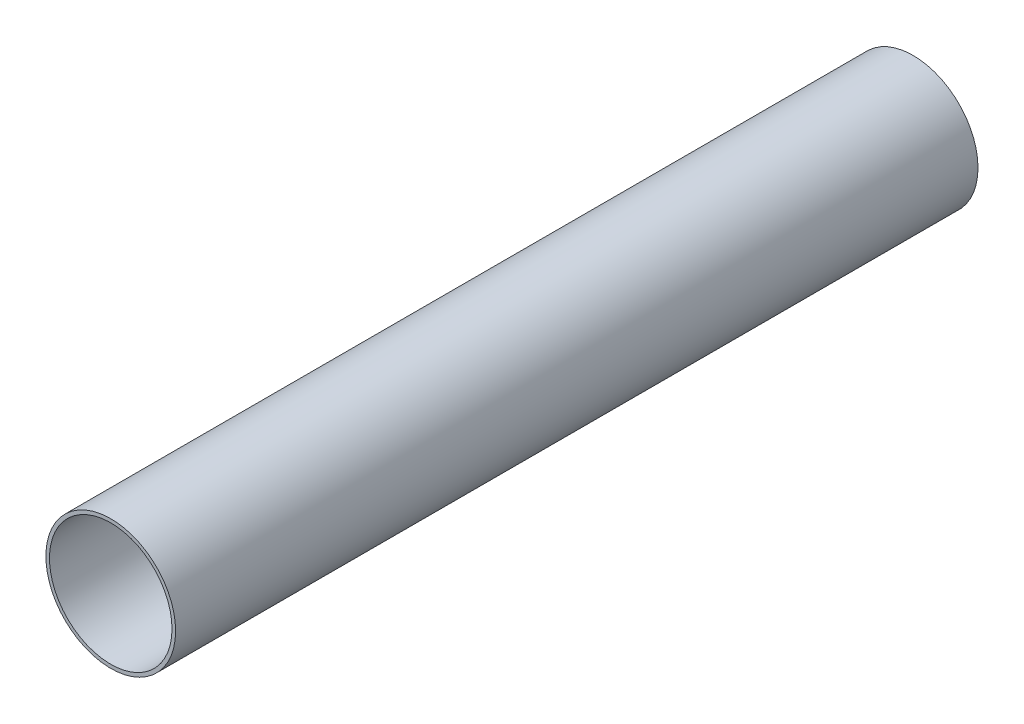
ISO-10303-21;
HEADER;
FILE_DESCRIPTION(('STEP AP214'),'2;1');
FILE_NAME('part.step','',(''),(''),'','','');
FILE_SCHEMA(('AUTOMOTIVE_DESIGN { 1 0 10303 214 1 1 1 1 }'));
ENDSEC;
DATA;
#1=APPLICATION_CONTEXT('core data for automotive mechanical design processes');
#2=APPLICATION_PROTOCOL_DEFINITION('international standard','automotive_design',2000,#1);
#3=PRODUCT_CONTEXT('',#1,'mechanical');
#4=PRODUCT('Part','Part','',(#3));
#5=PRODUCT_RELATED_PRODUCT_CATEGORY('part','',(#4));
#6=PRODUCT_DEFINITION_FORMATION('','',#4);
#7=PRODUCT_DEFINITION_CONTEXT('part definition',#1,'design');
#8=PRODUCT_DEFINITION('design','',#6,#7);
#9=PRODUCT_DEFINITION_SHAPE('','',#8);
#10=(LENGTH_UNIT() NAMED_UNIT(*) SI_UNIT(.MILLI.,.METRE.));
#11=(NAMED_UNIT(*) PLANE_ANGLE_UNIT() SI_UNIT($,.RADIAN.));
#12=(NAMED_UNIT(*) SI_UNIT($,.STERADIAN.) SOLID_ANGLE_UNIT());
#13=UNCERTAINTY_MEASURE_WITH_UNIT(LENGTH_MEASURE(1.E-05),#10,'distance_accuracy_value','');
#14=(GEOMETRIC_REPRESENTATION_CONTEXT(3) GLOBAL_UNCERTAINTY_ASSIGNED_CONTEXT((#13)) GLOBAL_UNIT_ASSIGNED_CONTEXT((#10,
#11,#12)) REPRESENTATION_CONTEXT('',''));
#15=CARTESIAN_POINT('',(0.,0.,0.));
#16=DIRECTION('',(0.,0.,1.));
#17=DIRECTION('',(1.,0.,0.));
#18=AXIS2_PLACEMENT_3D('',#15,#16,#17);
#19=CARTESIAN_POINT('',(0.,0.,275.));
#20=DIRECTION('',(0.,0.,1.));
#21=DIRECTION('',(1.,0.,0.));
#22=AXIS2_PLACEMENT_3D('',#19,#20,#21);
#23=PLANE('',#22);
#24=CARTESIAN_POINT('',(0.,0.,275.));
#25=DIRECTION('',(0.,0.,1.));
#26=DIRECTION('',(1.,0.,0.));
#27=AXIS2_PLACEMENT_3D('',#24,#25,#26);
#28=CIRCLE('',#27,22.23);
#29=CARTESIAN_POINT('',(22.23,0.,275.));
#30=VERTEX_POINT('',#29);
#31=EDGE_CURVE('E10',#30,#30,#28,.T.);
#32=ORIENTED_EDGE('',*,*,#31,.T.);
#33=EDGE_LOOP('',(#32));
#34=FACE_BOUND('',#33,.T.);
#35=CARTESIAN_POINT('',(0.,0.,275.));
#36=DIRECTION('',(0.,0.,1.));
#37=DIRECTION('',(1.,0.,0.));
#38=AXIS2_PLACEMENT_3D('',#35,#36,#37);
#39=CIRCLE('',#38,21.);
#40=CARTESIAN_POINT('',(21.,0.,275.));
#41=VERTEX_POINT('',#40);
#42=EDGE_CURVE('E48',#41,#41,#39,.T.);
#43=ORIENTED_EDGE('',*,*,#42,.F.);
#44=EDGE_LOOP('',(#43));
#45=FACE_BOUND('',#44,.T.);
#46=ADVANCED_FACE('F37',(#34,#45),#23,.T.);
#47=CARTESIAN_POINT('',(0.,0.,0.));
#48=DIRECTION('',(0.,0.,1.));
#49=DIRECTION('',(1.,0.,0.));
#50=AXIS2_PLACEMENT_3D('',#47,#48,#49);
#51=PLANE('',#50);
#52=CARTESIAN_POINT('',(0.,0.,0.));
#53=DIRECTION('',(0.,0.,1.));
#54=DIRECTION('',(1.,0.,0.));
#55=AXIS2_PLACEMENT_3D('',#52,#53,#54);
#56=CIRCLE('',#55,22.23);
#57=CARTESIAN_POINT('',(22.23,0.,0.));
#58=VERTEX_POINT('',#57);
#59=EDGE_CURVE('E41',#58,#58,#56,.T.);
#60=ORIENTED_EDGE('',*,*,#59,.F.);
#61=EDGE_LOOP('',(#60));
#62=FACE_BOUND('',#61,.T.);
#63=CARTESIAN_POINT('',(0.,0.,0.));
#64=DIRECTION('',(0.,0.,1.));
#65=DIRECTION('',(1.,0.,0.));
#66=AXIS2_PLACEMENT_3D('',#63,#64,#65);
#67=CIRCLE('',#66,21.);
#68=CARTESIAN_POINT('',(21.,0.,0.));
#69=VERTEX_POINT('',#68);
#70=EDGE_CURVE('E50',#69,#69,#67,.T.);
#71=ORIENTED_EDGE('',*,*,#70,.T.);
#72=EDGE_LOOP('',(#71));
#73=FACE_BOUND('',#72,.T.);
#74=ADVANCED_FACE('F60',(#62,#73),#51,.F.);
#75=CARTESIAN_POINT('',(0.,0.,275.));
#76=DIRECTION('',(0.,0.,-1.));
#77=DIRECTION('',(-1.,0.,0.));
#78=AXIS2_PLACEMENT_3D('',#75,#76,#77);
#79=CYLINDRICAL_SURFACE('',#78,22.23);
#80=ORIENTED_EDGE('',*,*,#31,.F.);
#81=EDGE_LOOP('',(#80));
#82=FACE_BOUND('',#81,.T.);
#83=ORIENTED_EDGE('',*,*,#59,.T.);
#84=EDGE_LOOP('',(#83));
#85=FACE_BOUND('',#84,.T.);
#86=ADVANCED_FACE('F39',(#82,#85),#79,.T.);
#87=CARTESIAN_POINT('',(0.,0.,275.));
#88=DIRECTION('',(0.,0.,-1.));
#89=DIRECTION('',(-1.,0.,0.));
#90=AXIS2_PLACEMENT_3D('',#87,#88,#89);
#91=CYLINDRICAL_SURFACE('',#90,21.);
#92=ORIENTED_EDGE('',*,*,#42,.T.);
#93=EDGE_LOOP('',(#92));
#94=FACE_BOUND('',#93,.T.);
#95=ORIENTED_EDGE('',*,*,#70,.F.);
#96=EDGE_LOOP('',(#95));
#97=FACE_BOUND('',#96,.T.);
#98=ADVANCED_FACE('F56',(#94,#97),#91,.F.);
#99=CLOSED_SHELL('',(#46,#74,#86,#98));
#100=MANIFOLD_SOLID_BREP('B2',#99);
#101=ADVANCED_BREP_SHAPE_REPRESENTATION('',(#18,#100),#14);
#102=SHAPE_DEFINITION_REPRESENTATION(#9,#101);
ENDSEC;
END-ISO-10303-21;
